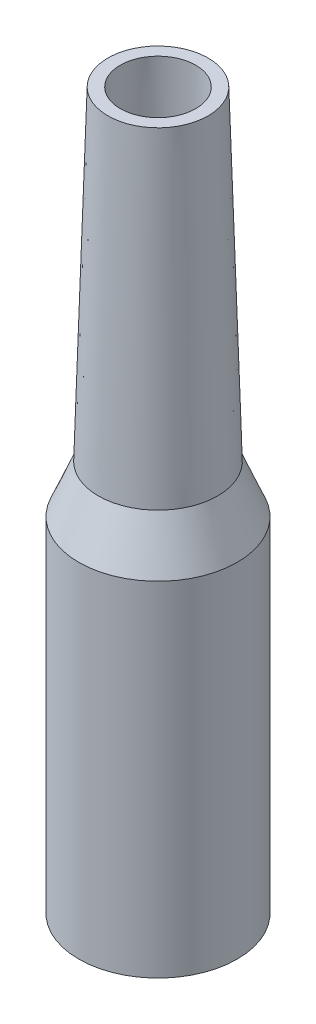
ISO-10303-21;
HEADER;
FILE_DESCRIPTION(('STEP AP214'),'2;1');
FILE_NAME('part.step','',(''),(''),'','','');
FILE_SCHEMA(('AUTOMOTIVE_DESIGN { 1 0 10303 214 1 1 1 1 }'));
ENDSEC;
DATA;
#1=APPLICATION_CONTEXT('core data for automotive mechanical design processes');
#2=APPLICATION_PROTOCOL_DEFINITION('international standard','automotive_design',2000,#1);
#3=PRODUCT_CONTEXT('',#1,'mechanical');
#4=PRODUCT('Part','Part','',(#3));
#5=PRODUCT_RELATED_PRODUCT_CATEGORY('part','',(#4));
#6=PRODUCT_DEFINITION_FORMATION('','',#4);
#7=PRODUCT_DEFINITION_CONTEXT('part definition',#1,'design');
#8=PRODUCT_DEFINITION('design','',#6,#7);
#9=PRODUCT_DEFINITION_SHAPE('','',#8);
#10=(LENGTH_UNIT() NAMED_UNIT(*) SI_UNIT(.MILLI.,.METRE.));
#11=(NAMED_UNIT(*) PLANE_ANGLE_UNIT() SI_UNIT($,.RADIAN.));
#12=(NAMED_UNIT(*) SI_UNIT($,.STERADIAN.) SOLID_ANGLE_UNIT());
#13=UNCERTAINTY_MEASURE_WITH_UNIT(LENGTH_MEASURE(1.E-05),#10,'distance_accuracy_value','');
#14=(GEOMETRIC_REPRESENTATION_CONTEXT(3) GLOBAL_UNCERTAINTY_ASSIGNED_CONTEXT((#13)) GLOBAL_UNIT_ASSIGNED_CONTEXT((#10,
#11,#12)) REPRESENTATION_CONTEXT('',''));
#15=CARTESIAN_POINT('',(0.,0.,0.));
#16=DIRECTION('',(0.,0.,1.));
#17=DIRECTION('',(1.,0.,0.));
#18=AXIS2_PLACEMENT_3D('',#15,#16,#17);
#19=CARTESIAN_POINT('',(0.,0.,0.));
#20=DIRECTION('',(0.,-1.,0.));
#21=DIRECTION('',(1.,0.,0.));
#22=AXIS2_PLACEMENT_3D('',#19,#20,#21);
#23=CONICAL_SURFACE('',#22,4.95,0.389097231055274);
#24=CARTESIAN_POINT('',(0.,-5.,0.));
#25=DIRECTION('',(0.,-1.,0.));
#26=DIRECTION('',(1.,0.,0.));
#27=AXIS2_PLACEMENT_3D('',#24,#25,#26);
#28=CIRCLE('',#27,6.99999999999998);
#29=CARTESIAN_POINT('',(7.,-4.99999999999998,0.));
#30=VERTEX_POINT('',#29);
#31=EDGE_CURVE('E80',#30,#30,#28,.T.);
#32=ORIENTED_EDGE('',*,*,#31,.T.);
#33=EDGE_LOOP('',(#32));
#34=FACE_BOUND('',#33,.T.);
#35=CARTESIAN_POINT('',(0.,0.,0.));
#36=DIRECTION('',(0.,-1.,0.));
#37=DIRECTION('',(1.,0.,0.));
#38=AXIS2_PLACEMENT_3D('',#35,#36,#37);
#39=CIRCLE('',#38,4.95);
#40=CARTESIAN_POINT('',(4.95,0.,0.));
#41=VERTEX_POINT('',#40);
#42=EDGE_CURVE('E10',#41,#41,#39,.T.);
#43=ORIENTED_EDGE('',*,*,#42,.F.);
#44=EDGE_LOOP('',(#43));
#45=FACE_BOUND('',#44,.T.);
#46=ADVANCED_FACE('F43',(#34,#45),#23,.F.);
#47=CARTESIAN_POINT('',(-1.16578010209826E-13,33.9852909359328,0.));
#48=DIRECTION('',(0.,-1.,0.));
#49=DIRECTION('',(1.,0.,0.));
#50=AXIS2_PLACEMENT_3D('',#47,#48,#49);
#51=CONICAL_SURFACE('',#50,3.95000000000012,0.0294160068079294);
#52=ORIENTED_EDGE('',*,*,#42,.T.);
#53=EDGE_LOOP('',(#52));
#54=FACE_BOUND('',#53,.T.);
#55=CARTESIAN_POINT('',(-1.16578010209826E-13,33.9852909359328,0.));
#56=DIRECTION('',(0.,-1.,0.));
#57=DIRECTION('',(1.,0.,0.));
#58=AXIS2_PLACEMENT_3D('',#55,#56,#57);
#59=CIRCLE('',#58,3.95000000000012);
#60=CARTESIAN_POINT('',(3.95,33.9852909359328,0.));
#61=VERTEX_POINT('',#60);
#62=EDGE_CURVE('E49',#61,#61,#59,.T.);
#63=ORIENTED_EDGE('',*,*,#62,.F.);
#64=EDGE_LOOP('',(#63));
#65=FACE_BOUND('',#64,.T.);
#66=ADVANCED_FACE('F100',(#54,#65),#51,.F.);
#67=CARTESIAN_POINT('',(5.25,33.9852909359329,0.));
#68=DIRECTION('',(0.,1.,0.));
#69=DIRECTION('',(-1.,0.,0.));
#70=AXIS2_PLACEMENT_3D('',#67,#68,#69);
#71=PLANE('',#70);
#72=ORIENTED_EDGE('',*,*,#62,.T.);
#73=EDGE_LOOP('',(#72));
#74=FACE_BOUND('',#73,.T.);
#75=CARTESIAN_POINT('',(-1.16578010209826E-13,33.9852909359328,0.));
#76=DIRECTION('',(0.,-1.,0.));
#77=DIRECTION('',(1.,0.,0.));
#78=AXIS2_PLACEMENT_3D('',#75,#76,#77);
#79=CIRCLE('',#78,5.25000000000012);
#80=CARTESIAN_POINT('',(5.25,33.9852909359329,0.));
#81=VERTEX_POINT('',#80);
#82=EDGE_CURVE('E54',#81,#81,#79,.T.);
#83=ORIENTED_EDGE('',*,*,#82,.F.);
#84=EDGE_LOOP('',(#83));
#85=FACE_BOUND('',#84,.T.);
#86=ADVANCED_FACE('F101',(#74,#85),#71,.T.);
#87=CARTESIAN_POINT('',(0.,0.,0.));
#88=DIRECTION('',(0.,-1.,0.));
#89=DIRECTION('',(1.,0.,0.));
#90=AXIS2_PLACEMENT_3D('',#87,#88,#89);
#91=CONICAL_SURFACE('',#90,6.25,0.0294160068079293);
#92=ORIENTED_EDGE('',*,*,#82,.T.);
#93=EDGE_LOOP('',(#92));
#94=FACE_BOUND('',#93,.T.);
#95=CARTESIAN_POINT('',(0.,0.,0.));
#96=DIRECTION('',(0.,-1.,0.));
#97=DIRECTION('',(1.,0.,0.));
#98=AXIS2_PLACEMENT_3D('',#95,#96,#97);
#99=CIRCLE('',#98,6.25);
#100=CARTESIAN_POINT('',(6.25,0.,0.));
#101=VERTEX_POINT('',#100);
#102=EDGE_CURVE('E58',#101,#101,#99,.T.);
#103=ORIENTED_EDGE('',*,*,#102,.F.);
#104=EDGE_LOOP('',(#103));
#105=FACE_BOUND('',#104,.T.);
#106=ADVANCED_FACE('F104',(#94,#105),#91,.T.);
#107=CARTESIAN_POINT('',(0.,-5.,0.));
#108=DIRECTION('',(0.,-1.,0.));
#109=DIRECTION('',(1.,0.,0.));
#110=AXIS2_PLACEMENT_3D('',#107,#108,#109);
#111=CONICAL_SURFACE('',#110,8.29999999999998,0.389097231055275);
#112=ORIENTED_EDGE('',*,*,#102,.T.);
#113=EDGE_LOOP('',(#112));
#114=FACE_BOUND('',#113,.T.);
#115=CARTESIAN_POINT('',(0.,-5.,0.));
#116=DIRECTION('',(0.,-1.,0.));
#117=DIRECTION('',(1.,0.,0.));
#118=AXIS2_PLACEMENT_3D('',#115,#116,#117);
#119=CIRCLE('',#118,8.29999999999998);
#120=CARTESIAN_POINT('',(8.3,-4.99999999999998,0.));
#121=VERTEX_POINT('',#120);
#122=EDGE_CURVE('E67',#121,#121,#119,.T.);
#123=ORIENTED_EDGE('',*,*,#122,.F.);
#124=EDGE_LOOP('',(#123));
#125=FACE_BOUND('',#124,.T.);
#126=ADVANCED_FACE('F112',(#114,#125),#111,.T.);
#127=CARTESIAN_POINT('',(3.43024899888577E-12,-1000.,0.));
#128=DIRECTION('',(0.,-1.,0.));
#129=DIRECTION('',(1.,0.,0.));
#130=AXIS2_PLACEMENT_3D('',#127,#128,#129);
#131=CYLINDRICAL_SURFACE('',#130,8.29999999999992);
#132=ORIENTED_EDGE('',*,*,#122,.T.);
#133=EDGE_LOOP('',(#132));
#134=FACE_BOUND('',#133,.T.);
#135=CARTESIAN_POINT('',(1.40640208954316E-13,-41.,0.));
#136=DIRECTION('',(0.,-1.,0.));
#137=DIRECTION('',(1.,0.,0.));
#138=AXIS2_PLACEMENT_3D('',#135,#136,#137);
#139=CIRCLE('',#138,8.29999999999986);
#140=CARTESIAN_POINT('',(8.30000000000001,-41.,0.));
#141=VERTEX_POINT('',#140);
#142=EDGE_CURVE('E68',#141,#141,#139,.T.);
#143=ORIENTED_EDGE('',*,*,#142,.F.);
#144=EDGE_LOOP('',(#143));
#145=FACE_BOUND('',#144,.T.);
#146=ADVANCED_FACE('F91',(#134,#145),#131,.T.);
#147=CARTESIAN_POINT('',(8.30000000000001,-41.,0.));
#148=DIRECTION('',(0.,-1.,0.));
#149=DIRECTION('',(1.,0.,0.));
#150=AXIS2_PLACEMENT_3D('',#147,#148,#149);
#151=PLANE('',#150);
#152=ORIENTED_EDGE('',*,*,#142,.T.);
#153=EDGE_LOOP('',(#152));
#154=FACE_BOUND('',#153,.T.);
#155=CARTESIAN_POINT('',(1.40640208954316E-13,-41.,0.));
#156=DIRECTION('',(0.,-1.,0.));
#157=DIRECTION('',(1.,0.,0.));
#158=AXIS2_PLACEMENT_3D('',#155,#156,#157);
#159=CIRCLE('',#158,6.99999999999986);
#160=CARTESIAN_POINT('',(7.00000000000001,-41.,0.));
#161=VERTEX_POINT('',#160);
#162=EDGE_CURVE('E74',#161,#161,#159,.T.);
#163=ORIENTED_EDGE('',*,*,#162,.F.);
#164=EDGE_LOOP('',(#163));
#165=FACE_BOUND('',#164,.T.);
#166=ADVANCED_FACE('F87',(#154,#165),#151,.T.);
#167=CARTESIAN_POINT('',(3.43024899888577E-12,-1000.,0.));
#168=DIRECTION('',(0.,-1.,0.));
#169=DIRECTION('',(1.,0.,0.));
#170=AXIS2_PLACEMENT_3D('',#167,#168,#169);
#171=CYLINDRICAL_SURFACE('',#170,6.99999999999992);
#172=ORIENTED_EDGE('',*,*,#162,.T.);
#173=EDGE_LOOP('',(#172));
#174=FACE_BOUND('',#173,.T.);
#175=ORIENTED_EDGE('',*,*,#31,.F.);
#176=EDGE_LOOP('',(#175));
#177=FACE_BOUND('',#176,.T.);
#178=ADVANCED_FACE('F83',(#174,#177),#171,.F.);
#179=CLOSED_SHELL('',(#46,#66,#86,#106,#126,#146,#166,#178));
#180=MANIFOLD_SOLID_BREP('B2',#179);
#181=ADVANCED_BREP_SHAPE_REPRESENTATION('',(#18,#180),#14);
#182=SHAPE_DEFINITION_REPRESENTATION(#9,#181);
ENDSEC;
END-ISO-10303-21;
